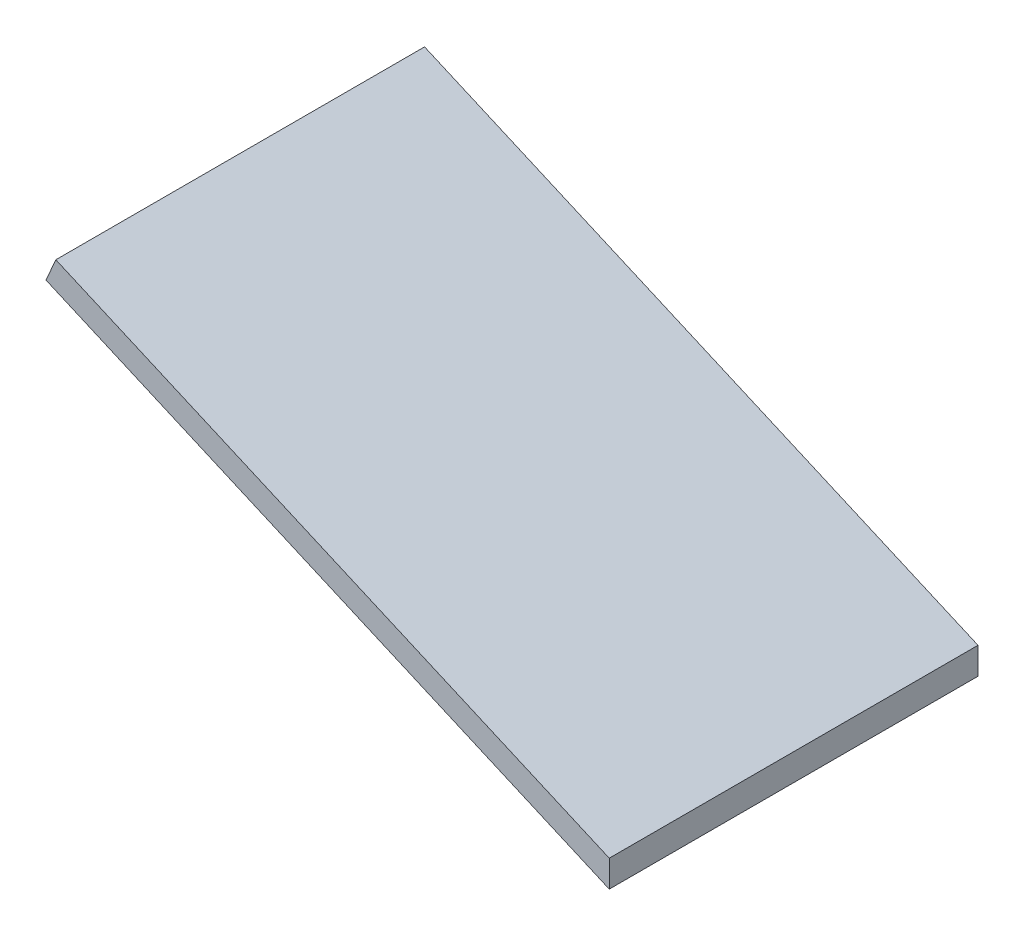
ISO-10303-21;
HEADER;
FILE_DESCRIPTION(('STEP AP214'),'2;1');
FILE_NAME('part.step','',(''),(''),'','','');
FILE_SCHEMA(('AUTOMOTIVE_DESIGN { 1 0 10303 214 1 1 1 1 }'));
ENDSEC;
DATA;
#1=APPLICATION_CONTEXT('core data for automotive mechanical design processes');
#2=APPLICATION_PROTOCOL_DEFINITION('international standard','automotive_design',2000,#1);
#3=PRODUCT_CONTEXT('',#1,'mechanical');
#4=PRODUCT('Part','Part','',(#3));
#5=PRODUCT_RELATED_PRODUCT_CATEGORY('part','',(#4));
#6=PRODUCT_DEFINITION_FORMATION('','',#4);
#7=PRODUCT_DEFINITION_CONTEXT('part definition',#1,'design');
#8=PRODUCT_DEFINITION('design','',#6,#7);
#9=PRODUCT_DEFINITION_SHAPE('','',#8);
#10=(LENGTH_UNIT() NAMED_UNIT(*) SI_UNIT(.MILLI.,.METRE.));
#11=(NAMED_UNIT(*) PLANE_ANGLE_UNIT() SI_UNIT($,.RADIAN.));
#12=(NAMED_UNIT(*) SI_UNIT($,.STERADIAN.) SOLID_ANGLE_UNIT());
#13=UNCERTAINTY_MEASURE_WITH_UNIT(LENGTH_MEASURE(1.E-05),#10,'distance_accuracy_value','');
#14=(GEOMETRIC_REPRESENTATION_CONTEXT(3) GLOBAL_UNCERTAINTY_ASSIGNED_CONTEXT((#13)) GLOBAL_UNIT_ASSIGNED_CONTEXT((#10,
#11,#12)) REPRESENTATION_CONTEXT('',''));
#15=CARTESIAN_POINT('',(0.,0.,0.));
#16=DIRECTION('',(0.,0.,1.));
#17=DIRECTION('',(1.,0.,0.));
#18=AXIS2_PLACEMENT_3D('',#15,#16,#17);
#19=CARTESIAN_POINT('',(-22.9128784747792,9.99999999999999,30.));
#20=DIRECTION('',(0.916515138991169,-0.399999999999997,0.));
#21=DIRECTION('',(0.399999999999997,0.916515138991169,0.));
#22=AXIS2_PLACEMENT_3D('',#19,#20,#21);
#23=PLANE('',#22);
#24=DIRECTION('',(-0.399999999999997,-0.916515138991169,0.));
#25=VECTOR('',#24,1.);
#26=CARTESIAN_POINT('',(-22.9128784747792,9.99999999999999,0.));
#27=LINE('',#26,#25);
#28=CARTESIAN_POINT('',(-22.1128784747792,11.8330302779823,0.));
#29=VERTEX_POINT('',#28);
#30=CARTESIAN_POINT('',(-22.9128784747792,9.99999999999999,0.));
#31=VERTEX_POINT('',#30);
#32=EDGE_CURVE('E93',#29,#31,#27,.T.);
#33=ORIENTED_EDGE('',*,*,#32,.T.);
#34=DIRECTION('',(0.,0.,-0.999999999999989));
#35=VECTOR('',#34,1.);
#36=CARTESIAN_POINT('',(-22.9128784747792,9.99999999999999,30.));
#37=LINE('',#36,#35);
#38=CARTESIAN_POINT('',(-22.9128784747792,9.99999999999999,30.));
#39=VERTEX_POINT('',#38);
#40=EDGE_CURVE('E11',#39,#31,#37,.T.);
#41=ORIENTED_EDGE('',*,*,#40,.F.);
#42=DIRECTION('',(-0.399999999999997,-0.916515138991169,0.));
#43=VECTOR('',#42,1.);
#44=CARTESIAN_POINT('',(-22.9128784747792,9.99999999999999,30.));
#45=LINE('',#44,#43);
#46=CARTESIAN_POINT('',(-22.1128784747792,11.8330302779823,30.));
#47=VERTEX_POINT('',#46);
#48=EDGE_CURVE('E81',#47,#39,#45,.T.);
#49=ORIENTED_EDGE('',*,*,#48,.F.);
#50=DIRECTION('',(0.,0.,-0.999999999999989));
#51=VECTOR('',#50,1.);
#52=CARTESIAN_POINT('',(-22.1128784747792,11.8330302779823,30.));
#53=LINE('',#52,#51);
#54=EDGE_CURVE('E89',#47,#29,#53,.T.);
#55=ORIENTED_EDGE('',*,*,#54,.T.);
#56=EDGE_LOOP('',(#33,#41,#49,#55));
#57=FACE_BOUND('',#56,.T.);
#58=ADVANCED_FACE('F30',(#57),#23,.F.);
#59=CARTESIAN_POINT('',(22.9128784747792,-10.0000000000001,30.));
#60=DIRECTION('',(0.399999999999999,0.916515138991168,0.));
#61=DIRECTION('',(-0.916515138991168,0.399999999999998,0.));
#62=AXIS2_PLACEMENT_3D('',#59,#60,#61);
#63=PLANE('',#62);
#64=DIRECTION('',(0.916515138991168,-0.399999999999999,0.));
#65=VECTOR('',#64,1.);
#66=CARTESIAN_POINT('',(22.9128784747792,-10.0000000000001,0.));
#67=LINE('',#66,#65);
#68=CARTESIAN_POINT('',(22.9128784747792,-10.0000000000001,0.));
#69=VERTEX_POINT('',#68);
#70=EDGE_CURVE('E85',#31,#69,#67,.T.);
#71=ORIENTED_EDGE('',*,*,#70,.T.);
#72=DIRECTION('',(0.,0.,-0.999999999999989));
#73=VECTOR('',#72,1.);
#74=CARTESIAN_POINT('',(22.9128784747792,-10.0000000000001,30.));
#75=LINE('',#74,#73);
#76=CARTESIAN_POINT('',(22.9128784747792,-10.0000000000001,30.));
#77=VERTEX_POINT('',#76);
#78=EDGE_CURVE('E38',#77,#69,#75,.T.);
#79=ORIENTED_EDGE('',*,*,#78,.F.);
#80=DIRECTION('',(0.916515138991168,-0.399999999999999,0.));
#81=VECTOR('',#80,1.);
#82=CARTESIAN_POINT('',(22.9128784747792,-10.0000000000001,30.));
#83=LINE('',#82,#81);
#84=EDGE_CURVE('E76',#39,#77,#83,.T.);
#85=ORIENTED_EDGE('',*,*,#84,.F.);
#86=ORIENTED_EDGE('',*,*,#40,.T.);
#87=EDGE_LOOP('',(#71,#79,#85,#86));
#88=FACE_BOUND('',#87,.T.);
#89=ADVANCED_FACE('F84',(#88),#63,.F.);
#90=CARTESIAN_POINT('',(22.9128784747792,-10.0000000000001,30.));
#91=DIRECTION('',(-1.,0.,0.));
#92=DIRECTION('',(0.,0.,0.999999999999989));
#93=AXIS2_PLACEMENT_3D('',#90,#91,#92);
#94=PLANE('',#93);
#95=DIRECTION('',(0.,1.,0.));
#96=VECTOR('',#95,1.);
#97=CARTESIAN_POINT('',(22.9128784747792,-10.0000000000001,0.));
#98=LINE('',#97,#96);
#99=CARTESIAN_POINT('',(22.9128784747792,-7.81782109764007,0.));
#100=VERTEX_POINT('',#99);
#101=EDGE_CURVE('E63',#69,#100,#98,.T.);
#102=ORIENTED_EDGE('',*,*,#101,.T.);
#103=DIRECTION('',(0.,0.,-0.999999999999989));
#104=VECTOR('',#103,1.);
#105=CARTESIAN_POINT('',(22.9128784747792,-7.81782109764007,30.));
#106=LINE('',#105,#104);
#107=CARTESIAN_POINT('',(22.9128784747792,-7.81782109764007,30.));
#108=VERTEX_POINT('',#107);
#109=EDGE_CURVE('E86',#108,#100,#106,.T.);
#110=ORIENTED_EDGE('',*,*,#109,.F.);
#111=DIRECTION('',(0.,1.,0.));
#112=VECTOR('',#111,1.);
#113=CARTESIAN_POINT('',(22.9128784747792,-10.0000000000001,30.));
#114=LINE('',#113,#112);
#115=EDGE_CURVE('E79',#77,#108,#114,.T.);
#116=ORIENTED_EDGE('',*,*,#115,.F.);
#117=ORIENTED_EDGE('',*,*,#78,.T.);
#118=EDGE_LOOP('',(#102,#110,#116,#117));
#119=FACE_BOUND('',#118,.T.);
#120=ADVANCED_FACE('F87',(#119),#94,.F.);
#121=CARTESIAN_POINT('',(22.9128784747792,-7.81782109764007,30.));
#122=DIRECTION('',(-0.399999999999998,-0.916515138991168,0.));
#123=DIRECTION('',(0.916515138991168,-0.399999999999998,0.));
#124=AXIS2_PLACEMENT_3D('',#121,#122,#123);
#125=PLANE('',#124);
#126=DIRECTION('',(-0.916515138991168,0.399999999999998,0.));
#127=VECTOR('',#126,1.);
#128=CARTESIAN_POINT('',(22.9128784747792,-7.81782109764007,0.));
#129=LINE('',#128,#127);
#130=EDGE_CURVE('E69',#100,#29,#129,.T.);
#131=ORIENTED_EDGE('',*,*,#130,.T.);
#132=ORIENTED_EDGE('',*,*,#54,.F.);
#133=DIRECTION('',(-0.916515138991168,0.399999999999998,0.));
#134=VECTOR('',#133,1.);
#135=CARTESIAN_POINT('',(22.9128784747792,-7.81782109764007,30.));
#136=LINE('',#135,#134);
#137=EDGE_CURVE('E46',#108,#47,#136,.T.);
#138=ORIENTED_EDGE('',*,*,#137,.F.);
#139=ORIENTED_EDGE('',*,*,#109,.T.);
#140=EDGE_LOOP('',(#131,#132,#138,#139));
#141=FACE_BOUND('',#140,.T.);
#142=ADVANCED_FACE('F100',(#141),#125,.F.);
#143=CARTESIAN_POINT('',(0.,0.,30.));
#144=DIRECTION('',(0.,0.,0.999999999999989));
#145=DIRECTION('',(1.,0.,0.));
#146=AXIS2_PLACEMENT_3D('',#143,#144,#145);
#147=PLANE('',#146);
#148=ORIENTED_EDGE('',*,*,#48,.T.);
#149=ORIENTED_EDGE('',*,*,#84,.T.);
#150=ORIENTED_EDGE('',*,*,#115,.T.);
#151=ORIENTED_EDGE('',*,*,#137,.T.);
#152=EDGE_LOOP('',(#148,#149,#150,#151));
#153=FACE_BOUND('',#152,.T.);
#154=ADVANCED_FACE('F77',(#153),#147,.T.);
#155=CARTESIAN_POINT('',(0.,0.,0.));
#156=DIRECTION('',(0.,0.,0.999999999999989));
#157=DIRECTION('',(1.,0.,0.));
#158=AXIS2_PLACEMENT_3D('',#155,#156,#157);
#159=PLANE('',#158);
#160=ORIENTED_EDGE('',*,*,#32,.F.);
#161=ORIENTED_EDGE('',*,*,#130,.F.);
#162=ORIENTED_EDGE('',*,*,#101,.F.);
#163=ORIENTED_EDGE('',*,*,#70,.F.);
#164=EDGE_LOOP('',(#160,#161,#162,#163));
#165=FACE_BOUND('',#164,.T.);
#166=ADVANCED_FACE('F103',(#165),#159,.F.);
#167=CLOSED_SHELL('',(#58,#89,#120,#142,#154,#166));
#168=MANIFOLD_SOLID_BREP('B2',#167);
#169=ADVANCED_BREP_SHAPE_REPRESENTATION('',(#18,#168),#14);
#170=SHAPE_DEFINITION_REPRESENTATION(#9,#169);
ENDSEC;
END-ISO-10303-21;
